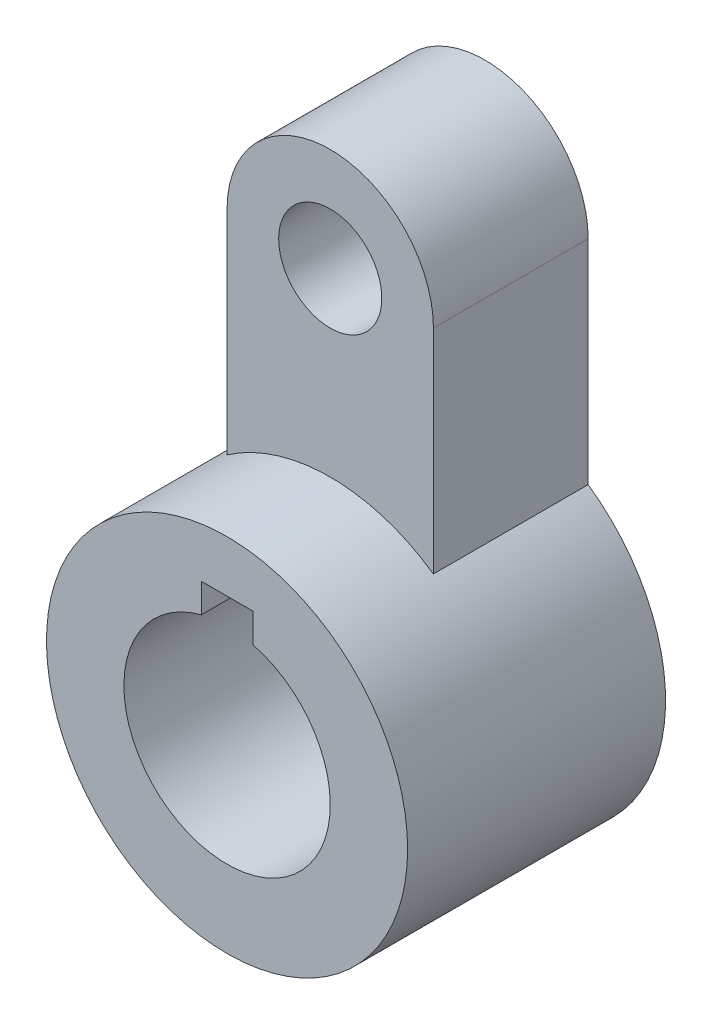
ISO-10303-21;
HEADER;
FILE_DESCRIPTION(('STEP AP214'),'2;1');
FILE_NAME('part.step','',(''),(''),'','','');
FILE_SCHEMA(('AUTOMOTIVE_DESIGN { 1 0 10303 214 1 1 1 1 }'));
ENDSEC;
DATA;
#1=APPLICATION_CONTEXT('core data for automotive mechanical design processes');
#2=APPLICATION_PROTOCOL_DEFINITION('international standard','automotive_design',2000,#1);
#3=PRODUCT_CONTEXT('',#1,'mechanical');
#4=PRODUCT('Part','Part','',(#3));
#5=PRODUCT_RELATED_PRODUCT_CATEGORY('part','',(#4));
#6=PRODUCT_DEFINITION_FORMATION('','',#4);
#7=PRODUCT_DEFINITION_CONTEXT('part definition',#1,'design');
#8=PRODUCT_DEFINITION('design','',#6,#7);
#9=PRODUCT_DEFINITION_SHAPE('','',#8);
#10=(LENGTH_UNIT() NAMED_UNIT(*) SI_UNIT(.MILLI.,.METRE.));
#11=(NAMED_UNIT(*) PLANE_ANGLE_UNIT() SI_UNIT($,.RADIAN.));
#12=(NAMED_UNIT(*) SI_UNIT($,.STERADIAN.) SOLID_ANGLE_UNIT());
#13=UNCERTAINTY_MEASURE_WITH_UNIT(LENGTH_MEASURE(1.E-05),#10,'distance_accuracy_value','');
#14=(GEOMETRIC_REPRESENTATION_CONTEXT(3) GLOBAL_UNCERTAINTY_ASSIGNED_CONTEXT((#13)) GLOBAL_UNIT_ASSIGNED_CONTEXT((#10,
#11,#12)) REPRESENTATION_CONTEXT('',''));
#15=CARTESIAN_POINT('',(0.,0.,0.));
#16=DIRECTION('',(0.,0.,1.));
#17=DIRECTION('',(1.,0.,0.));
#18=AXIS2_PLACEMENT_3D('',#15,#16,#17);
#19=CARTESIAN_POINT('',(0.,0.,31.75));
#20=DIRECTION('',(0.,0.,1.));
#21=DIRECTION('',(1.,0.,0.));
#22=AXIS2_PLACEMENT_3D('',#19,#20,#21);
#23=PLANE('',#22);
#24=CARTESIAN_POINT('',(0.,0.,31.75));
#25=DIRECTION('',(0.,0.,1.));
#26=DIRECTION('',(1.,0.,0.));
#27=AXIS2_PLACEMENT_3D('',#24,#25,#26);
#28=CIRCLE('',#27,22.225);
#29=CARTESIAN_POINT('',(22.225,0.,31.75));
#30=VERTEX_POINT('',#29);
#31=EDGE_CURVE('E11',#30,#30,#28,.T.);
#32=ORIENTED_EDGE('',*,*,#31,.T.);
#33=EDGE_LOOP('',(#32));
#34=FACE_BOUND('',#33,.T.);
#35=DIRECTION('',(0.,-1.,0.));
#36=VECTOR('',#35,1.);
#37=CARTESIAN_POINT('',(-3.175,0.,31.75));
#38=LINE('',#37,#36);
#39=CARTESIAN_POINT('',(-3.175,15.875,31.75));
#40=VERTEX_POINT('',#39);
#41=CARTESIAN_POINT('',(-3.175,12.2967221242085,31.75));
#42=VERTEX_POINT('',#41);
#43=EDGE_CURVE('E143',#40,#42,#38,.T.);
#44=ORIENTED_EDGE('',*,*,#43,.F.);
#45=DIRECTION('',(1.,0.,0.));
#46=VECTOR('',#45,1.);
#47=CARTESIAN_POINT('',(0.,15.875,31.75));
#48=LINE('',#47,#46);
#49=CARTESIAN_POINT('',(3.175,15.875,31.75));
#50=VERTEX_POINT('',#49);
#51=EDGE_CURVE('E59',#40,#50,#48,.T.);
#52=ORIENTED_EDGE('',*,*,#51,.T.);
#53=DIRECTION('',(0.,-1.,0.));
#54=VECTOR('',#53,1.);
#55=CARTESIAN_POINT('',(3.175,0.,31.75));
#56=LINE('',#55,#54);
#57=CARTESIAN_POINT('',(3.175,12.2967221242085,31.75));
#58=VERTEX_POINT('',#57);
#59=EDGE_CURVE('E130',#50,#58,#56,.T.);
#60=ORIENTED_EDGE('',*,*,#59,.T.);
#61=CARTESIAN_POINT('',(0.,0.,31.75));
#62=DIRECTION('',(0.,0.,1.));
#63=DIRECTION('',(1.,0.,0.));
#64=AXIS2_PLACEMENT_3D('',#61,#62,#63);
#65=CIRCLE('',#64,12.7);
#66=EDGE_CURVE('E134',#42,#58,#65,.T.);
#67=ORIENTED_EDGE('',*,*,#66,.F.);
#68=EDGE_LOOP('',(#44,#52,#60,#67));
#69=FACE_BOUND('',#68,.T.);
#70=ADVANCED_FACE('F43',(#34,#69),#23,.T.);
#71=CARTESIAN_POINT('',(0.,0.,0.));
#72=DIRECTION('',(0.,0.,1.));
#73=DIRECTION('',(1.,0.,0.));
#74=AXIS2_PLACEMENT_3D('',#71,#72,#73);
#75=PLANE('',#74);
#76=CARTESIAN_POINT('',(0.,44.45,0.));
#77=DIRECTION('',(0.,0.,1.));
#78=DIRECTION('',(1.,0.,0.));
#79=AXIS2_PLACEMENT_3D('',#76,#77,#78);
#80=CIRCLE('',#79,6.35);
#81=CARTESIAN_POINT('',(-6.35,44.45,0.));
#82=VERTEX_POINT('',#81);
#83=EDGE_CURVE('E152',#82,#82,#80,.T.);
#84=ORIENTED_EDGE('',*,*,#83,.T.);
#85=EDGE_LOOP('',(#84));
#86=FACE_BOUND('',#85,.T.);
#87=CARTESIAN_POINT('',(0.,0.,0.));
#88=DIRECTION('',(0.,0.,1.));
#89=DIRECTION('',(1.,0.,0.));
#90=AXIS2_PLACEMENT_3D('',#87,#88,#89);
#91=CIRCLE('',#90,22.225);
#92=CARTESIAN_POINT('',(-12.7,18.2389864027582,0.));
#93=VERTEX_POINT('',#92);
#94=CARTESIAN_POINT('',(12.7,18.2389864027582,0.));
#95=VERTEX_POINT('',#94);
#96=EDGE_CURVE('E47',#93,#95,#91,.T.);
#97=ORIENTED_EDGE('',*,*,#96,.F.);
#98=DIRECTION('',(0.,-1.,0.));
#99=VECTOR('',#98,1.);
#100=CARTESIAN_POINT('',(-12.7,0.,0.));
#101=LINE('',#100,#99);
#102=CARTESIAN_POINT('',(-12.7,44.45,0.));
#103=VERTEX_POINT('',#102);
#104=EDGE_CURVE('E163',#103,#93,#101,.T.);
#105=ORIENTED_EDGE('',*,*,#104,.F.);
#106=CARTESIAN_POINT('',(0.,44.45,0.));
#107=DIRECTION('',(0.,0.,1.));
#108=DIRECTION('',(1.,0.,0.));
#109=AXIS2_PLACEMENT_3D('',#106,#107,#108);
#110=CIRCLE('',#109,12.7);
#111=CARTESIAN_POINT('',(12.7,44.45,0.));
#112=VERTEX_POINT('',#111);
#113=EDGE_CURVE('E186',#112,#103,#110,.T.);
#114=ORIENTED_EDGE('',*,*,#113,.F.);
#115=DIRECTION('',(0.,-1.,0.));
#116=VECTOR('',#115,1.);
#117=CARTESIAN_POINT('',(12.7,0.,0.));
#118=LINE('',#117,#116);
#119=EDGE_CURVE('E182',#112,#95,#118,.T.);
#120=ORIENTED_EDGE('',*,*,#119,.T.);
#121=EDGE_LOOP('',(#97,#105,#114,#120));
#122=FACE_BOUND('',#121,.T.);
#123=DIRECTION('',(1.,0.,0.));
#124=VECTOR('',#123,1.);
#125=CARTESIAN_POINT('',(0.,15.875,0.));
#126=LINE('',#125,#124);
#127=CARTESIAN_POINT('',(-3.175,15.875,0.));
#128=VERTEX_POINT('',#127);
#129=CARTESIAN_POINT('',(3.175,15.875,0.));
#130=VERTEX_POINT('',#129);
#131=EDGE_CURVE('E112',#128,#130,#126,.T.);
#132=ORIENTED_EDGE('',*,*,#131,.F.);
#133=DIRECTION('',(0.,-1.,0.));
#134=VECTOR('',#133,1.);
#135=CARTESIAN_POINT('',(-3.175,0.,0.));
#136=LINE('',#135,#134);
#137=CARTESIAN_POINT('',(-3.175,12.2967221242085,0.));
#138=VERTEX_POINT('',#137);
#139=EDGE_CURVE('E122',#128,#138,#136,.T.);
#140=ORIENTED_EDGE('',*,*,#139,.T.);
#141=CARTESIAN_POINT('',(0.,0.,0.));
#142=DIRECTION('',(0.,0.,1.));
#143=DIRECTION('',(1.,0.,0.));
#144=AXIS2_PLACEMENT_3D('',#141,#142,#143);
#145=CIRCLE('',#144,12.7);
#146=CARTESIAN_POINT('',(3.175,12.2967221242085,0.));
#147=VERTEX_POINT('',#146);
#148=EDGE_CURVE('E67',#138,#147,#145,.T.);
#149=ORIENTED_EDGE('',*,*,#148,.T.);
#150=DIRECTION('',(0.,-1.,0.));
#151=VECTOR('',#150,1.);
#152=CARTESIAN_POINT('',(3.175,0.,0.));
#153=LINE('',#152,#151);
#154=EDGE_CURVE('E119',#130,#147,#153,.T.);
#155=ORIENTED_EDGE('',*,*,#154,.F.);
#156=EDGE_LOOP('',(#132,#140,#149,#155));
#157=FACE_BOUND('',#156,.T.);
#158=ADVANCED_FACE('F128',(#86,#122,#157),#75,.F.);
#159=CARTESIAN_POINT('',(0.,0.,31.75));
#160=DIRECTION('',(0.,0.,-1.));
#161=DIRECTION('',(-1.,0.,0.));
#162=AXIS2_PLACEMENT_3D('',#159,#160,#161);
#163=CYLINDRICAL_SURFACE('',#162,22.225);
#164=ORIENTED_EDGE('',*,*,#31,.F.);
#165=EDGE_LOOP('',(#164));
#166=FACE_BOUND('',#165,.T.);
#167=ORIENTED_EDGE('',*,*,#96,.T.);
#168=DIRECTION('',(0.,0.,-1.));
#169=VECTOR('',#168,1.);
#170=CARTESIAN_POINT('',(12.7,18.2389864027582,19.05));
#171=LINE('',#170,#169);
#172=CARTESIAN_POINT('',(12.7,18.2389864027582,19.05));
#173=VERTEX_POINT('',#172);
#174=EDGE_CURVE('E178',#173,#95,#171,.T.);
#175=ORIENTED_EDGE('',*,*,#174,.F.);
#176=CARTESIAN_POINT('',(0.,0.,19.05));
#177=DIRECTION('',(0.,0.,1.));
#178=DIRECTION('',(1.,0.,0.));
#179=AXIS2_PLACEMENT_3D('',#176,#177,#178);
#180=CIRCLE('',#179,22.225);
#181=CARTESIAN_POINT('',(-12.7,18.2389864027582,19.05));
#182=VERTEX_POINT('',#181);
#183=EDGE_CURVE('E175',#173,#182,#180,.T.);
#184=ORIENTED_EDGE('',*,*,#183,.T.);
#185=DIRECTION('',(0.,0.,-1.));
#186=VECTOR('',#185,1.);
#187=CARTESIAN_POINT('',(-12.7,18.2389864027582,19.05));
#188=LINE('',#187,#186);
#189=EDGE_CURVE('E196',#182,#93,#188,.T.);
#190=ORIENTED_EDGE('',*,*,#189,.T.);
#191=EDGE_LOOP('',(#167,#175,#184,#190));
#192=FACE_BOUND('',#191,.T.);
#193=ADVANCED_FACE('F45',(#166,#192),#163,.T.);
#194=CARTESIAN_POINT('',(12.7,0.,19.05));
#195=DIRECTION('',(1.,0.,0.));
#196=DIRECTION('',(0.,0.,-1.));
#197=AXIS2_PLACEMENT_3D('',#194,#195,#196);
#198=PLANE('',#197);
#199=ORIENTED_EDGE('',*,*,#119,.F.);
#200=DIRECTION('',(0.,0.,-1.));
#201=VECTOR('',#200,1.);
#202=CARTESIAN_POINT('',(12.7,44.45,19.05));
#203=LINE('',#202,#201);
#204=CARTESIAN_POINT('',(12.7,44.45,19.05));
#205=VERTEX_POINT('',#204);
#206=EDGE_CURVE('E204',#205,#112,#203,.T.);
#207=ORIENTED_EDGE('',*,*,#206,.F.);
#208=DIRECTION('',(0.,-1.,0.));
#209=VECTOR('',#208,1.);
#210=CARTESIAN_POINT('',(12.7,0.,19.05));
#211=LINE('',#210,#209);
#212=EDGE_CURVE('E162',#205,#173,#211,.T.);
#213=ORIENTED_EDGE('',*,*,#212,.T.);
#214=ORIENTED_EDGE('',*,*,#174,.T.);
#215=EDGE_LOOP('',(#199,#207,#213,#214));
#216=FACE_BOUND('',#215,.T.);
#217=ADVANCED_FACE('F215',(#216),#198,.T.);
#218=CARTESIAN_POINT('',(0.,44.45,19.05));
#219=DIRECTION('',(0.,0.,-1.));
#220=DIRECTION('',(-1.,0.,0.));
#221=AXIS2_PLACEMENT_3D('',#218,#219,#220);
#222=CYLINDRICAL_SURFACE('',#221,12.7);
#223=ORIENTED_EDGE('',*,*,#113,.T.);
#224=DIRECTION('',(0.,0.,-1.));
#225=VECTOR('',#224,1.);
#226=CARTESIAN_POINT('',(-12.7,44.45,19.05));
#227=LINE('',#226,#225);
#228=CARTESIAN_POINT('',(-12.7,44.45,19.05));
#229=VERTEX_POINT('',#228);
#230=EDGE_CURVE('E200',#229,#103,#227,.T.);
#231=ORIENTED_EDGE('',*,*,#230,.F.);
#232=CARTESIAN_POINT('',(0.,44.45,19.05));
#233=DIRECTION('',(0.,0.,1.));
#234=DIRECTION('',(1.,0.,0.));
#235=AXIS2_PLACEMENT_3D('',#232,#233,#234);
#236=CIRCLE('',#235,12.7);
#237=EDGE_CURVE('E167',#205,#229,#236,.T.);
#238=ORIENTED_EDGE('',*,*,#237,.F.);
#239=ORIENTED_EDGE('',*,*,#206,.T.);
#240=EDGE_LOOP('',(#223,#231,#238,#239));
#241=FACE_BOUND('',#240,.T.);
#242=ADVANCED_FACE('F219',(#241),#222,.T.);
#243=CARTESIAN_POINT('',(-12.7,0.,19.05));
#244=DIRECTION('',(1.,0.,0.));
#245=DIRECTION('',(0.,0.,-1.));
#246=AXIS2_PLACEMENT_3D('',#243,#244,#245);
#247=PLANE('',#246);
#248=ORIENTED_EDGE('',*,*,#104,.T.);
#249=ORIENTED_EDGE('',*,*,#189,.F.);
#250=DIRECTION('',(0.,-1.,0.));
#251=VECTOR('',#250,1.);
#252=CARTESIAN_POINT('',(-12.7,0.,19.05));
#253=LINE('',#252,#251);
#254=EDGE_CURVE('E171',#229,#182,#253,.T.);
#255=ORIENTED_EDGE('',*,*,#254,.F.);
#256=ORIENTED_EDGE('',*,*,#230,.T.);
#257=EDGE_LOOP('',(#248,#249,#255,#256));
#258=FACE_BOUND('',#257,.T.);
#259=ADVANCED_FACE('F221',(#258),#247,.F.);
#260=CARTESIAN_POINT('',(0.,44.45,19.05));
#261=DIRECTION('',(0.,0.,-1.));
#262=DIRECTION('',(-1.,0.,0.));
#263=AXIS2_PLACEMENT_3D('',#260,#261,#262);
#264=CYLINDRICAL_SURFACE('',#263,6.35);
#265=CARTESIAN_POINT('',(0.,44.45,19.05));
#266=DIRECTION('',(0.,0.,1.));
#267=DIRECTION('',(1.,0.,0.));
#268=AXIS2_PLACEMENT_3D('',#265,#266,#267);
#269=CIRCLE('',#268,6.35);
#270=CARTESIAN_POINT('',(-6.35,44.45,19.05));
#271=VERTEX_POINT('',#270);
#272=EDGE_CURVE('E158',#271,#271,#269,.T.);
#273=CARTESIAN_POINT('',(-6.35,44.45,19.05));
#274=CARTESIAN_POINT('',(-6.35,44.45,18.8515625));
#275=CARTESIAN_POINT('',(-6.35,44.45,18.653125));
#276=CARTESIAN_POINT('',(-6.35,44.45,18.25625));
#277=CARTESIAN_POINT('',(-6.35,44.45,18.0578125));
#278=CARTESIAN_POINT('',(-6.35,44.45,17.6609375));
#279=CARTESIAN_POINT('',(-6.35,44.45,17.4625));
#280=CARTESIAN_POINT('',(-6.35,44.45,17.065625));
#281=CARTESIAN_POINT('',(-6.35,44.45,16.8671875));
#282=CARTESIAN_POINT('',(-6.35,44.45,16.4703125));
#283=CARTESIAN_POINT('',(-6.35,44.45,16.271875));
#284=CARTESIAN_POINT('',(-6.35,44.45,15.875));
#285=CARTESIAN_POINT('',(-6.35,44.45,15.6765625));
#286=CARTESIAN_POINT('',(-6.35,44.45,15.2796875));
#287=CARTESIAN_POINT('',(-6.35,44.45,15.08125));
#288=CARTESIAN_POINT('',(-6.35,44.45,14.684375));
#289=CARTESIAN_POINT('',(-6.35,44.45,14.4859375));
#290=CARTESIAN_POINT('',(-6.35,44.45,14.0890625));
#291=CARTESIAN_POINT('',(-6.35,44.45,13.890625));
#292=CARTESIAN_POINT('',(-6.35,44.45,13.49375));
#293=CARTESIAN_POINT('',(-6.35,44.45,13.2953125));
#294=CARTESIAN_POINT('',(-6.35,44.45,12.8984375));
#295=CARTESIAN_POINT('',(-6.35,44.45,12.7));
#296=CARTESIAN_POINT('',(-6.35,44.45,12.303125));
#297=CARTESIAN_POINT('',(-6.35,44.45,12.1046875));
#298=CARTESIAN_POINT('',(-6.35,44.45,11.7078125));
#299=CARTESIAN_POINT('',(-6.35,44.45,11.509375));
#300=CARTESIAN_POINT('',(-6.35,44.45,11.1125));
#301=CARTESIAN_POINT('',(-6.35,44.45,10.9140625));
#302=CARTESIAN_POINT('',(-6.35,44.45,10.5171875));
#303=CARTESIAN_POINT('',(-6.35,44.45,10.31875));
#304=CARTESIAN_POINT('',(-6.35,44.45,9.92187499999999));
#305=CARTESIAN_POINT('',(-6.35,44.45,9.72343749999999));
#306=CARTESIAN_POINT('',(-6.35,44.45,9.32656249999999));
#307=CARTESIAN_POINT('',(-6.35,44.45,9.12812499999999));
#308=CARTESIAN_POINT('',(-6.35,44.45,8.73124999999999));
#309=CARTESIAN_POINT('',(-6.35,44.45,8.53281249999999));
#310=CARTESIAN_POINT('',(-6.35,44.45,8.13593749999999));
#311=CARTESIAN_POINT('',(-6.35,44.45,7.93749999999999));
#312=CARTESIAN_POINT('',(-6.35,44.45,7.54062499999999));
#313=CARTESIAN_POINT('',(-6.35,44.45,7.34218749999999));
#314=CARTESIAN_POINT('',(-6.35,44.45,6.94531249999999));
#315=CARTESIAN_POINT('',(-6.35,44.45,6.74687499999999));
#316=CARTESIAN_POINT('',(-6.35,44.45,6.35));
#317=CARTESIAN_POINT('',(-6.35,44.45,6.15156249999999));
#318=CARTESIAN_POINT('',(-6.35,44.45,5.75468749999999));
#319=CARTESIAN_POINT('',(-6.35,44.45,5.55624999999999));
#320=CARTESIAN_POINT('',(-6.35,44.45,5.15937499999999));
#321=CARTESIAN_POINT('',(-6.35,44.45,4.9609375));
#322=CARTESIAN_POINT('',(-6.35,44.45,4.5640625));
#323=CARTESIAN_POINT('',(-6.35,44.45,4.365625));
#324=CARTESIAN_POINT('',(-6.35,44.45,3.96875));
#325=CARTESIAN_POINT('',(-6.35,44.45,3.7703125));
#326=CARTESIAN_POINT('',(-6.35,44.45,3.37343749999999));
#327=CARTESIAN_POINT('',(-6.35,44.45,3.17499999999999));
#328=CARTESIAN_POINT('',(-6.35,44.45,2.77812499999999));
#329=CARTESIAN_POINT('',(-6.35,44.45,2.57968749999999));
#330=CARTESIAN_POINT('',(-6.35,44.45,2.1828125));
#331=CARTESIAN_POINT('',(-6.35,44.45,1.984375));
#332=CARTESIAN_POINT('',(-6.35,44.45,1.5875));
#333=CARTESIAN_POINT('',(-6.35,44.45,1.3890625));
#334=CARTESIAN_POINT('',(-6.35,44.45,0.992187499999997));
#335=CARTESIAN_POINT('',(-6.35,44.45,0.793749999999997));
#336=CARTESIAN_POINT('',(-6.35,44.45,0.396874999999997));
#337=CARTESIAN_POINT('',(-6.35,44.45,0.198437499999997));
#338=CARTESIAN_POINT('',(-6.35,44.45,0.));
#339=B_SPLINE_CURVE_WITH_KNOTS('',3,(#273,#274,#275,#276,#277,#278,#279,#280,#281,#282,#283,
#284,#285,#286,#287,#288,#289,#290,#291,#292,#293,#294,#295,#296,#297,#298,#299,#300,#301,#302,
#303,#304,#305,#306,#307,#308,#309,#310,#311,#312,#313,#314,#315,#316,#317,#318,#319,#320,#321,
#322,#323,#324,#325,#326,#327,#328,#329,#330,#331,#332,#333,#334,#335,#336,#337,#338),
.UNSPECIFIED.,.F.,.F.,(4,2,2,2,2,2,2,2,2,2,2,2,2,2,2,2,2,2,2,2,2,2,2,2,2,2,2,2,2,2,2,2,4),(0.,
0.595312499999997,1.190625,1.7859375,2.38125,2.9765625,3.571875,4.1671875,4.7625,5.3578125,
5.953125,6.5484375,7.14374999999999,7.73906249999999,8.33437499999999,8.92968749999999,
9.52499999999999,10.1203125,10.715625,11.3109375,11.90625,12.5015625,13.096875,13.6921875,
14.2875,14.8828125,15.478125,16.0734375,16.66875,17.2640625,17.859375,18.4546875,19.05),.UNSPECIFIED.);
#340=EDGE_CURVE('BSEAM225',#271,#82,#339,.T.);
#341=ORIENTED_EDGE('',*,*,#272,.T.);
#342=ORIENTED_EDGE('',*,*,#83,.F.);
#343=ORIENTED_EDGE('',*,*,#340,.T.);
#344=ORIENTED_EDGE('',*,*,#340,.F.);
#345=EDGE_LOOP('',(#341,#343,#342,#344));
#346=FACE_BOUND('',#345,.T.);
#347=ADVANCED_FACE('F225',(#346),#264,.F.);
#348=CARTESIAN_POINT('',(0.,0.,19.05));
#349=DIRECTION('',(0.,0.,1.));
#350=DIRECTION('',(1.,0.,0.));
#351=AXIS2_PLACEMENT_3D('',#348,#349,#350);
#352=PLANE('',#351);
#353=ORIENTED_EDGE('',*,*,#272,.F.);
#354=EDGE_LOOP('',(#353));
#355=FACE_BOUND('',#354,.T.);
#356=ORIENTED_EDGE('',*,*,#212,.F.);
#357=ORIENTED_EDGE('',*,*,#237,.T.);
#358=ORIENTED_EDGE('',*,*,#254,.T.);
#359=ORIENTED_EDGE('',*,*,#183,.F.);
#360=EDGE_LOOP('',(#356,#357,#358,#359));
#361=FACE_BOUND('',#360,.T.);
#362=ADVANCED_FACE('F223',(#355,#361),#352,.T.);
#363=CARTESIAN_POINT('',(0.,15.875,0.));
#364=DIRECTION('',(0.,-1.,0.));
#365=DIRECTION('',(0.,0.,-1.));
#366=AXIS2_PLACEMENT_3D('',#363,#364,#365);
#367=PLANE('',#366);
#368=ORIENTED_EDGE('',*,*,#51,.F.);
#369=DIRECTION('',(0.,0.,1.));
#370=VECTOR('',#369,1.);
#371=CARTESIAN_POINT('',(-3.175,15.875,0.));
#372=LINE('',#371,#370);
#373=EDGE_CURVE('E108',#128,#40,#372,.T.);
#374=ORIENTED_EDGE('',*,*,#373,.F.);
#375=ORIENTED_EDGE('',*,*,#131,.T.);
#376=DIRECTION('',(0.,0.,1.));
#377=VECTOR('',#376,1.);
#378=CARTESIAN_POINT('',(3.175,15.875,0.));
#379=LINE('',#378,#377);
#380=EDGE_CURVE('E149',#130,#50,#379,.T.);
#381=ORIENTED_EDGE('',*,*,#380,.T.);
#382=EDGE_LOOP('',(#368,#374,#375,#381));
#383=FACE_BOUND('',#382,.T.);
#384=ADVANCED_FACE('F110',(#383),#367,.T.);
#385=CARTESIAN_POINT('',(3.175,0.,0.));
#386=DIRECTION('',(-1.,0.,0.));
#387=DIRECTION('',(0.,0.,1.));
#388=AXIS2_PLACEMENT_3D('',#385,#386,#387);
#389=PLANE('',#388);
#390=ORIENTED_EDGE('',*,*,#59,.F.);
#391=ORIENTED_EDGE('',*,*,#380,.F.);
#392=ORIENTED_EDGE('',*,*,#154,.T.);
#393=DIRECTION('',(0.,0.,1.));
#394=VECTOR('',#393,1.);
#395=CARTESIAN_POINT('',(3.175,12.2967221242085,0.));
#396=LINE('',#395,#394);
#397=EDGE_CURVE('E153',#147,#58,#396,.T.);
#398=ORIENTED_EDGE('',*,*,#397,.T.);
#399=EDGE_LOOP('',(#390,#391,#392,#398));
#400=FACE_BOUND('',#399,.T.);
#401=ADVANCED_FACE('F232',(#400),#389,.T.);
#402=CARTESIAN_POINT('',(0.,0.,0.));
#403=DIRECTION('',(0.,0.,1.));
#404=DIRECTION('',(1.,0.,0.));
#405=AXIS2_PLACEMENT_3D('',#402,#403,#404);
#406=CYLINDRICAL_SURFACE('',#405,12.7);
#407=ORIENTED_EDGE('',*,*,#66,.T.);
#408=ORIENTED_EDGE('',*,*,#397,.F.);
#409=ORIENTED_EDGE('',*,*,#148,.F.);
#410=DIRECTION('',(0.,0.,1.));
#411=VECTOR('',#410,1.);
#412=CARTESIAN_POINT('',(-3.175,12.2967221242085,0.));
#413=LINE('',#412,#411);
#414=EDGE_CURVE('E118',#138,#42,#413,.T.);
#415=ORIENTED_EDGE('',*,*,#414,.T.);
#416=EDGE_LOOP('',(#407,#408,#409,#415));
#417=FACE_BOUND('',#416,.T.);
#418=ADVANCED_FACE('F294',(#417),#406,.F.);
#419=CARTESIAN_POINT('',(-3.175,0.,0.));
#420=DIRECTION('',(-1.,0.,0.));
#421=DIRECTION('',(0.,0.,1.));
#422=AXIS2_PLACEMENT_3D('',#419,#420,#421);
#423=PLANE('',#422);
#424=ORIENTED_EDGE('',*,*,#43,.T.);
#425=ORIENTED_EDGE('',*,*,#414,.F.);
#426=ORIENTED_EDGE('',*,*,#139,.F.);
#427=ORIENTED_EDGE('',*,*,#373,.T.);
#428=EDGE_LOOP('',(#424,#425,#426,#427));
#429=FACE_BOUND('',#428,.T.);
#430=ADVANCED_FACE('F123',(#429),#423,.F.);
#431=CLOSED_SHELL('',(#70,#158,#193,#217,#242,#259,#347,#362,#384,#401,#418,#430));
#432=MANIFOLD_SOLID_BREP('B2',#431);
#433=ADVANCED_BREP_SHAPE_REPRESENTATION('',(#18,#432),#14);
#434=SHAPE_DEFINITION_REPRESENTATION(#9,#433);
ENDSEC;
END-ISO-10303-21;
